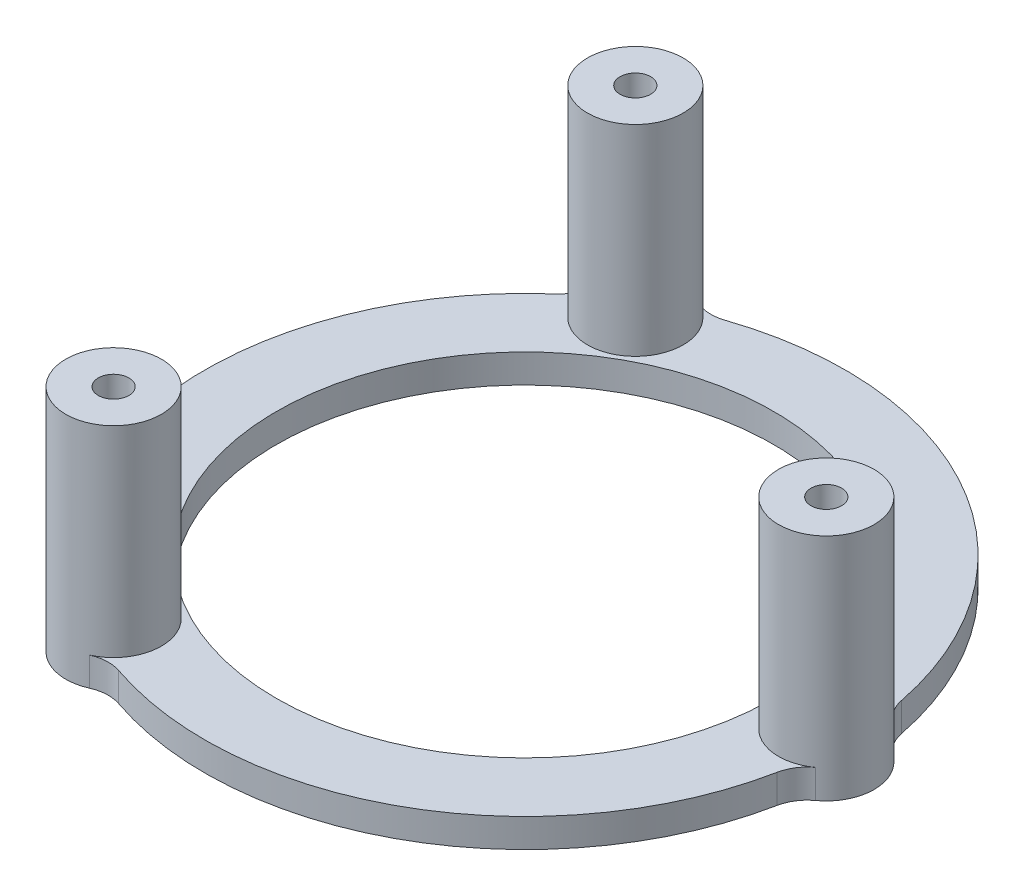
ISO-10303-21;
HEADER;
FILE_DESCRIPTION(('STEP AP214'),'2;1');
FILE_NAME('part.step','',(''),(''),'','','');
FILE_SCHEMA(('AUTOMOTIVE_DESIGN { 1 0 10303 214 1 1 1 1 }'));
ENDSEC;
DATA;
#1=APPLICATION_CONTEXT('core data for automotive mechanical design processes');
#2=APPLICATION_PROTOCOL_DEFINITION('international standard','automotive_design',2000,#1);
#3=PRODUCT_CONTEXT('',#1,'mechanical');
#4=PRODUCT('Part','Part','',(#3));
#5=PRODUCT_RELATED_PRODUCT_CATEGORY('part','',(#4));
#6=PRODUCT_DEFINITION_FORMATION('','',#4);
#7=PRODUCT_DEFINITION_CONTEXT('part definition',#1,'design');
#8=PRODUCT_DEFINITION('design','',#6,#7);
#9=PRODUCT_DEFINITION_SHAPE('','',#8);
#10=(LENGTH_UNIT() NAMED_UNIT(*) SI_UNIT(.MILLI.,.METRE.));
#11=(NAMED_UNIT(*) PLANE_ANGLE_UNIT() SI_UNIT($,.RADIAN.));
#12=(NAMED_UNIT(*) SI_UNIT($,.STERADIAN.) SOLID_ANGLE_UNIT());
#13=UNCERTAINTY_MEASURE_WITH_UNIT(LENGTH_MEASURE(1.E-05),#10,'distance_accuracy_value','');
#14=(GEOMETRIC_REPRESENTATION_CONTEXT(3) GLOBAL_UNCERTAINTY_ASSIGNED_CONTEXT((#13)) GLOBAL_UNIT_ASSIGNED_CONTEXT((#10,
#11,#12)) REPRESENTATION_CONTEXT('',''));
#15=CARTESIAN_POINT('',(0.,0.,0.));
#16=DIRECTION('',(0.,0.,1.));
#17=DIRECTION('',(1.,0.,0.));
#18=AXIS2_PLACEMENT_3D('',#15,#16,#17);
#19=CARTESIAN_POINT('',(0.,1.5,0.));
#20=DIRECTION('',(0.,1.,0.));
#21=DIRECTION('',(0.,0.,1.));
#22=AXIS2_PLACEMENT_3D('',#19,#20,#21);
#23=PLANE('',#22);
#24=CARTESIAN_POINT('',(0.,1.5,0.));
#25=DIRECTION('',(0.,1.,0.));
#26=DIRECTION('',(0.,0.,1.));
#27=AXIS2_PLACEMENT_3D('',#24,#25,#26);
#28=CIRCLE('',#27,13.);
#29=CARTESIAN_POINT('',(0.,1.5,13.));
#30=VERTEX_POINT('',#29);
#31=EDGE_CURVE('E213',#30,#30,#28,.T.);
#32=ORIENTED_EDGE('',*,*,#31,.F.);
#33=EDGE_LOOP('',(#32));
#34=FACE_BOUND('',#33,.T.);
#35=CARTESIAN_POINT('',(-7.875,1.5,13.6399001096049));
#36=DIRECTION('',(0.,1.,0.));
#37=DIRECTION('',(0.,0.,1.));
#38=AXIS2_PLACEMENT_3D('',#35,#36,#37);
#39=CIRCLE('',#38,2.5);
#40=CARTESIAN_POINT('',(-6.8567934789032,1.5,15.9231555662711));
#41=VERTEX_POINT('',#40);
#42=CARTESIAN_POINT('',(-10.3614604893508,1.5,13.8997351243692));
#43=VERTEX_POINT('',#42);
#44=EDGE_CURVE('E74',#41,#43,#39,.T.);
#45=ORIENTED_EDGE('',*,*,#44,.F.);
#46=CARTESIAN_POINT('',(-6.04222826202577,1.5,17.7497599316041));
#47=DIRECTION('',(0.,1.,0.));
#48=DIRECTION('',(0.,0.,1.));
#49=AXIS2_PLACEMENT_3D('',#46,#47,#48);
#50=CIRCLE('',#49,2.);
#51=CARTESIAN_POINT('',(-5.39772391407635,1.5,15.8564522055663));
#52=VERTEX_POINT('',#51);
#53=EDGE_CURVE('E275',#41,#52,#50,.F.);
#54=ORIENTED_EDGE('',*,*,#53,.T.);
#55=CARTESIAN_POINT('',(0.,1.5,0.));
#56=DIRECTION('',(0.,1.,0.));
#57=DIRECTION('',(0.,0.,1.));
#58=AXIS2_PLACEMENT_3D('',#55,#56,#57);
#59=CIRCLE('',#58,16.75);
#60=CARTESIAN_POINT('',(16.4309523809524,1.5,3.25366007057826));
#61=VERTEX_POINT('',#60);
#62=EDGE_CURVE('E224',#52,#61,#59,.T.);
#63=ORIENTED_EDGE('',*,*,#62,.T.);
#64=CARTESIAN_POINT('',(18.3928571428571,1.5,3.64215679542342));
#65=DIRECTION('',(0.,1.,0.));
#66=DIRECTION('',(0.,0.,1.));
#67=AXIS2_PLACEMENT_3D('',#64,#65,#66);
#68=CIRCLE('',#67,2.);
#69=CARTESIAN_POINT('',(17.218253968254,1.5,2.0234204419019));
#70=VERTEX_POINT('',#69);
#71=EDGE_CURVE('E261',#61,#70,#68,.F.);
#72=ORIENTED_EDGE('',*,*,#71,.T.);
#73=CARTESIAN_POINT('',(15.75,1.5,0.));
#74=DIRECTION('',(0.,1.,0.));
#75=DIRECTION('',(0.,0.,1.));
#76=AXIS2_PLACEMENT_3D('',#73,#74,#75);
#77=CIRCLE('',#76,2.5);
#78=CARTESIAN_POINT('',(17.218253968254,1.5,-2.0234204419019));
#79=VERTEX_POINT('',#78);
#80=EDGE_CURVE('E208',#79,#70,#77,.T.);
#81=ORIENTED_EDGE('',*,*,#80,.F.);
#82=CARTESIAN_POINT('',(18.3928571428571,1.5,-3.64215679542341));
#83=DIRECTION('',(0.,1.,0.));
#84=DIRECTION('',(0.,0.,1.));
#85=AXIS2_PLACEMENT_3D('',#82,#83,#84);
#86=CIRCLE('',#85,2.);
#87=CARTESIAN_POINT('',(16.4309523809524,1.5,-3.25366007057825));
#88=VERTEX_POINT('',#87);
#89=EDGE_CURVE('E266',#79,#88,#86,.F.);
#90=ORIENTED_EDGE('',*,*,#89,.T.);
#91=CARTESIAN_POINT('',(0.,1.5,0.));
#92=DIRECTION('',(0.,1.,0.));
#93=DIRECTION('',(0.,0.,1.));
#94=AXIS2_PLACEMENT_3D('',#91,#92,#93);
#95=CIRCLE('',#94,16.75);
#96=CARTESIAN_POINT('',(-5.39772391407637,1.5,-15.8564522055663));
#97=VERTEX_POINT('',#96);
#98=EDGE_CURVE('E227',#88,#97,#95,.T.);
#99=ORIENTED_EDGE('',*,*,#98,.T.);
#100=CARTESIAN_POINT('',(-6.04222826202579,1.5,-17.7497599316041));
#101=DIRECTION('',(0.,1.,0.));
#102=DIRECTION('',(0.,0.,1.));
#103=AXIS2_PLACEMENT_3D('',#100,#101,#102);
#104=CIRCLE('',#103,2.);
#105=CARTESIAN_POINT('',(-6.85679347890322,1.5,-15.9231555662711));
#106=VERTEX_POINT('',#105);
#107=EDGE_CURVE('E67',#97,#106,#104,.F.);
#108=ORIENTED_EDGE('',*,*,#107,.T.);
#109=CARTESIAN_POINT('',(-7.87500000000001,1.5,-13.6399001096049));
#110=DIRECTION('',(0.,1.,0.));
#111=DIRECTION('',(0.,0.,1.));
#112=AXIS2_PLACEMENT_3D('',#109,#110,#111);
#113=CIRCLE('',#112,2.5);
#114=CARTESIAN_POINT('',(-10.3614604893508,1.5,-13.8997351243692));
#115=VERTEX_POINT('',#114);
#116=EDGE_CURVE('E188',#115,#106,#113,.T.);
#117=ORIENTED_EDGE('',*,*,#116,.F.);
#118=CARTESIAN_POINT('',(-12.3506288808314,1.5,-14.1076031361806));
#119=DIRECTION('',(0.,1.,0.));
#120=DIRECTION('',(0.,0.,1.));
#121=AXIS2_PLACEMENT_3D('',#118,#119,#120);
#122=CIRCLE('',#121,2.);
#123=CARTESIAN_POINT('',(-11.033228466876,1.5,-12.602792134988));
#124=VERTEX_POINT('',#123);
#125=EDGE_CURVE('E236',#115,#124,#122,.F.);
#126=ORIENTED_EDGE('',*,*,#125,.T.);
#127=CARTESIAN_POINT('',(0.,1.5,0.));
#128=DIRECTION('',(0.,1.,0.));
#129=DIRECTION('',(0.,0.,1.));
#130=AXIS2_PLACEMENT_3D('',#127,#128,#129);
#131=CIRCLE('',#130,16.75);
#132=CARTESIAN_POINT('',(-11.033228466876,1.5,12.6027921349881));
#133=VERTEX_POINT('',#132);
#134=EDGE_CURVE('E169',#124,#133,#131,.T.);
#135=ORIENTED_EDGE('',*,*,#134,.T.);
#136=CARTESIAN_POINT('',(-12.3506288808314,1.5,14.1076031361807));
#137=DIRECTION('',(0.,1.,0.));
#138=DIRECTION('',(0.,0.,1.));
#139=AXIS2_PLACEMENT_3D('',#136,#137,#138);
#140=CIRCLE('',#139,2.);
#141=EDGE_CURVE('E233',#133,#43,#140,.F.);
#142=ORIENTED_EDGE('',*,*,#141,.T.);
#143=EDGE_LOOP('',(#45,#54,#63,#72,#81,#90,#99,#108,#117,#126,#135,#142));
#144=FACE_BOUND('',#143,.T.);
#145=ADVANCED_FACE('F59',(#34,#144),#23,.T.);
#146=CARTESIAN_POINT('',(0.,0.,0.));
#147=DIRECTION('',(0.,1.,0.));
#148=DIRECTION('',(0.,0.,1.));
#149=AXIS2_PLACEMENT_3D('',#146,#147,#148);
#150=PLANE('',#149);
#151=CARTESIAN_POINT('',(0.,0.,0.));
#152=DIRECTION('',(0.,1.,0.));
#153=DIRECTION('',(0.,0.,1.));
#154=AXIS2_PLACEMENT_3D('',#151,#152,#153);
#155=CIRCLE('',#154,13.);
#156=CARTESIAN_POINT('',(0.,0.,13.));
#157=VERTEX_POINT('',#156);
#158=EDGE_CURVE('E207',#157,#157,#155,.T.);
#159=ORIENTED_EDGE('',*,*,#158,.T.);
#160=EDGE_LOOP('',(#159));
#161=FACE_BOUND('',#160,.T.);
#162=CARTESIAN_POINT('',(0.,0.,0.));
#163=DIRECTION('',(0.,1.,0.));
#164=DIRECTION('',(0.,0.,1.));
#165=AXIS2_PLACEMENT_3D('',#162,#163,#164);
#166=CIRCLE('',#165,16.75);
#167=CARTESIAN_POINT('',(-5.39772391407635,0.,15.8564522055663));
#168=VERTEX_POINT('',#167);
#169=CARTESIAN_POINT('',(16.4309523809524,0.,3.25366007057826));
#170=VERTEX_POINT('',#169);
#171=EDGE_CURVE('E306',#168,#170,#166,.T.);
#172=ORIENTED_EDGE('',*,*,#171,.F.);
#173=CARTESIAN_POINT('',(-6.04222826202577,0.,17.7497599316041));
#174=DIRECTION('',(0.,1.,0.));
#175=DIRECTION('',(0.,0.,1.));
#176=AXIS2_PLACEMENT_3D('',#173,#174,#175);
#177=CIRCLE('',#176,2.);
#178=CARTESIAN_POINT('',(-6.8567934789032,0.,15.9231555662711));
#179=VERTEX_POINT('',#178);
#180=EDGE_CURVE('E278',#168,#179,#177,.T.);
#181=ORIENTED_EDGE('',*,*,#180,.T.);
#182=CARTESIAN_POINT('',(-7.875,0.,13.6399001096049));
#183=DIRECTION('',(0.,1.,0.));
#184=DIRECTION('',(0.,0.,1.));
#185=AXIS2_PLACEMENT_3D('',#182,#183,#184);
#186=CIRCLE('',#185,2.5);
#187=CARTESIAN_POINT('',(-10.3614604893508,0.,13.8997351243692));
#188=VERTEX_POINT('',#187);
#189=EDGE_CURVE('E309',#188,#179,#186,.T.);
#190=ORIENTED_EDGE('',*,*,#189,.F.);
#191=CARTESIAN_POINT('',(-12.3506288808314,0.,14.1076031361807));
#192=DIRECTION('',(0.,1.,0.));
#193=DIRECTION('',(0.,0.,1.));
#194=AXIS2_PLACEMENT_3D('',#191,#192,#193);
#195=CIRCLE('',#194,2.);
#196=CARTESIAN_POINT('',(-11.033228466876,0.,12.6027921349881));
#197=VERTEX_POINT('',#196);
#198=EDGE_CURVE('E273',#188,#197,#195,.T.);
#199=ORIENTED_EDGE('',*,*,#198,.T.);
#200=CARTESIAN_POINT('',(0.,0.,0.));
#201=DIRECTION('',(0.,1.,0.));
#202=DIRECTION('',(0.,0.,1.));
#203=AXIS2_PLACEMENT_3D('',#200,#201,#202);
#204=CIRCLE('',#203,16.75);
#205=CARTESIAN_POINT('',(-11.033228466876,0.,-12.602792134988));
#206=VERTEX_POINT('',#205);
#207=EDGE_CURVE('E312',#206,#197,#204,.T.);
#208=ORIENTED_EDGE('',*,*,#207,.F.);
#209=CARTESIAN_POINT('',(-12.3506288808314,0.,-14.1076031361806));
#210=DIRECTION('',(0.,1.,0.));
#211=DIRECTION('',(0.,0.,1.));
#212=AXIS2_PLACEMENT_3D('',#209,#210,#211);
#213=CIRCLE('',#212,2.);
#214=CARTESIAN_POINT('',(-10.3614604893508,0.,-13.8997351243692));
#215=VERTEX_POINT('',#214);
#216=EDGE_CURVE('E251',#206,#215,#213,.T.);
#217=ORIENTED_EDGE('',*,*,#216,.T.);
#218=CARTESIAN_POINT('',(-7.87500000000001,0.,-13.6399001096049));
#219=DIRECTION('',(0.,1.,0.));
#220=DIRECTION('',(0.,0.,1.));
#221=AXIS2_PLACEMENT_3D('',#218,#219,#220);
#222=CIRCLE('',#221,2.5);
#223=CARTESIAN_POINT('',(-6.85679347890322,0.,-15.9231555662711));
#224=VERTEX_POINT('',#223);
#225=EDGE_CURVE('E314',#224,#215,#222,.T.);
#226=ORIENTED_EDGE('',*,*,#225,.F.);
#227=CARTESIAN_POINT('',(-6.04222826202579,0.,-17.7497599316041));
#228=DIRECTION('',(0.,1.,0.));
#229=DIRECTION('',(0.,0.,1.));
#230=AXIS2_PLACEMENT_3D('',#227,#228,#229);
#231=CIRCLE('',#230,2.);
#232=CARTESIAN_POINT('',(-5.39772391407637,0.,-15.8564522055663));
#233=VERTEX_POINT('',#232);
#234=EDGE_CURVE('E13',#224,#233,#231,.T.);
#235=ORIENTED_EDGE('',*,*,#234,.T.);
#236=CARTESIAN_POINT('',(0.,0.,0.));
#237=DIRECTION('',(0.,1.,0.));
#238=DIRECTION('',(0.,0.,1.));
#239=AXIS2_PLACEMENT_3D('',#236,#237,#238);
#240=CIRCLE('',#239,16.75);
#241=CARTESIAN_POINT('',(16.4309523809524,0.,-3.25366007057825));
#242=VERTEX_POINT('',#241);
#243=EDGE_CURVE('E316',#242,#233,#240,.T.);
#244=ORIENTED_EDGE('',*,*,#243,.F.);
#245=CARTESIAN_POINT('',(18.3928571428571,0.,-3.64215679542341));
#246=DIRECTION('',(0.,1.,0.));
#247=DIRECTION('',(0.,0.,1.));
#248=AXIS2_PLACEMENT_3D('',#245,#246,#247);
#249=CIRCLE('',#248,2.);
#250=CARTESIAN_POINT('',(17.218253968254,0.,-2.0234204419019));
#251=VERTEX_POINT('',#250);
#252=EDGE_CURVE('E268',#242,#251,#249,.T.);
#253=ORIENTED_EDGE('',*,*,#252,.T.);
#254=CARTESIAN_POINT('',(15.75,0.,0.));
#255=DIRECTION('',(0.,1.,0.));
#256=DIRECTION('',(0.,0.,1.));
#257=AXIS2_PLACEMENT_3D('',#254,#255,#256);
#258=CIRCLE('',#257,2.5);
#259=CARTESIAN_POINT('',(17.218253968254,0.,2.0234204419019));
#260=VERTEX_POINT('',#259);
#261=EDGE_CURVE('E319',#260,#251,#258,.T.);
#262=ORIENTED_EDGE('',*,*,#261,.F.);
#263=CARTESIAN_POINT('',(18.3928571428571,0.,3.64215679542342));
#264=DIRECTION('',(0.,1.,0.));
#265=DIRECTION('',(0.,0.,1.));
#266=AXIS2_PLACEMENT_3D('',#263,#264,#265);
#267=CIRCLE('',#266,2.);
#268=EDGE_CURVE('E264',#260,#170,#267,.T.);
#269=ORIENTED_EDGE('',*,*,#268,.T.);
#270=EDGE_LOOP('',(#172,#181,#190,#199,#208,#217,#226,#235,#244,#253,#262,#269));
#271=FACE_BOUND('',#270,.T.);
#272=ADVANCED_FACE('F336',(#161,#271),#150,.F.);
#273=CARTESIAN_POINT('',(0.,1.5,0.));
#274=DIRECTION('',(0.,-1.,0.));
#275=DIRECTION('',(0.,0.,-1.));
#276=AXIS2_PLACEMENT_3D('',#273,#274,#275);
#277=CYLINDRICAL_SURFACE('',#276,13.);
#278=ORIENTED_EDGE('',*,*,#31,.T.);
#279=EDGE_LOOP('',(#278));
#280=FACE_BOUND('',#279,.T.);
#281=ORIENTED_EDGE('',*,*,#158,.F.);
#282=EDGE_LOOP('',(#281));
#283=FACE_BOUND('',#282,.T.);
#284=ADVANCED_FACE('F332',(#280,#283),#277,.F.);
#285=CARTESIAN_POINT('',(15.75,12.,0.));
#286=DIRECTION('',(0.,-1.,0.));
#287=DIRECTION('',(0.,0.,-1.));
#288=AXIS2_PLACEMENT_3D('',#285,#286,#287);
#289=CYLINDRICAL_SURFACE('',#288,2.5);
#290=CARTESIAN_POINT('',(15.75,12.,0.));
#291=DIRECTION('',(0.,1.,0.));
#292=DIRECTION('',(0.,0.,1.));
#293=AXIS2_PLACEMENT_3D('',#290,#291,#292);
#294=CIRCLE('',#293,2.5);
#295=CARTESIAN_POINT('',(15.75,12.,2.5));
#296=VERTEX_POINT('',#295);
#297=EDGE_CURVE('E203',#296,#296,#294,.T.);
#298=ORIENTED_EDGE('',*,*,#297,.F.);
#299=EDGE_LOOP('',(#298));
#300=FACE_BOUND('',#299,.T.);
#301=ORIENTED_EDGE('',*,*,#80,.T.);
#302=DIRECTION('',(0.,-1.,0.));
#303=VECTOR('',#302,1.);
#304=CARTESIAN_POINT('',(17.218253968254,12.,2.0234204419019));
#305=LINE('',#304,#303);
#306=EDGE_CURVE('E296',#70,#260,#305,.T.);
#307=ORIENTED_EDGE('',*,*,#306,.T.);
#308=ORIENTED_EDGE('',*,*,#261,.T.);
#309=DIRECTION('',(0.,-1.,0.));
#310=VECTOR('',#309,1.);
#311=CARTESIAN_POINT('',(17.218253968254,12.,-2.0234204419019));
#312=LINE('',#311,#310);
#313=EDGE_CURVE('E298',#251,#79,#312,.F.);
#314=ORIENTED_EDGE('',*,*,#313,.T.);
#315=EDGE_LOOP('',(#301,#307,#308,#314));
#316=FACE_BOUND('',#315,.T.);
#317=ADVANCED_FACE('F396',(#300,#316),#289,.T.);
#318=CARTESIAN_POINT('',(15.75,12.,0.));
#319=DIRECTION('',(0.,1.,0.));
#320=DIRECTION('',(0.,0.,1.));
#321=AXIS2_PLACEMENT_3D('',#318,#319,#320);
#322=PLANE('',#321);
#323=CARTESIAN_POINT('',(15.75,12.,0.));
#324=DIRECTION('',(0.,1.,0.));
#325=DIRECTION('',(0.,0.,1.));
#326=AXIS2_PLACEMENT_3D('',#323,#324,#325);
#327=CIRCLE('',#326,0.799999999999988);
#328=CARTESIAN_POINT('',(15.75,12.,0.799999999999988));
#329=VERTEX_POINT('',#328);
#330=EDGE_CURVE('E163',#329,#329,#327,.T.);
#331=ORIENTED_EDGE('',*,*,#330,.F.);
#332=EDGE_LOOP('',(#331));
#333=FACE_BOUND('',#332,.T.);
#334=ORIENTED_EDGE('',*,*,#297,.T.);
#335=EDGE_LOOP('',(#334));
#336=FACE_BOUND('',#335,.T.);
#337=ADVANCED_FACE('F393',(#333,#336),#322,.T.);
#338=CARTESIAN_POINT('',(-7.875,12.,13.6399001096049));
#339=DIRECTION('',(0.,-1.,0.));
#340=DIRECTION('',(0.,0.,-1.));
#341=AXIS2_PLACEMENT_3D('',#338,#339,#340);
#342=CYLINDRICAL_SURFACE('',#341,2.5);
#343=CARTESIAN_POINT('',(-7.875,12.,13.6399001096049));
#344=DIRECTION('',(0.,1.,0.));
#345=DIRECTION('',(0.,0.,1.));
#346=AXIS2_PLACEMENT_3D('',#343,#344,#345);
#347=CIRCLE('',#346,2.5);
#348=CARTESIAN_POINT('',(-7.875,12.,16.1399001096049));
#349=VERTEX_POINT('',#348);
#350=EDGE_CURVE('E212',#349,#349,#347,.T.);
#351=ORIENTED_EDGE('',*,*,#350,.F.);
#352=EDGE_LOOP('',(#351));
#353=FACE_BOUND('',#352,.T.);
#354=ORIENTED_EDGE('',*,*,#44,.T.);
#355=DIRECTION('',(0.,-1.,0.));
#356=VECTOR('',#355,1.);
#357=CARTESIAN_POINT('',(-10.3614604893508,12.,13.8997351243692));
#358=LINE('',#357,#356);
#359=EDGE_CURVE('E254',#43,#188,#358,.T.);
#360=ORIENTED_EDGE('',*,*,#359,.T.);
#361=ORIENTED_EDGE('',*,*,#189,.T.);
#362=DIRECTION('',(0.,-1.,0.));
#363=VECTOR('',#362,1.);
#364=CARTESIAN_POINT('',(-6.8567934789032,12.,15.9231555662711));
#365=LINE('',#364,#363);
#366=EDGE_CURVE('E252',#179,#41,#365,.F.);
#367=ORIENTED_EDGE('',*,*,#366,.T.);
#368=EDGE_LOOP('',(#354,#360,#361,#367));
#369=FACE_BOUND('',#368,.T.);
#370=ADVANCED_FACE('F373',(#353,#369),#342,.T.);
#371=CARTESIAN_POINT('',(-7.875,12.,13.6399001096049));
#372=DIRECTION('',(0.,1.,0.));
#373=DIRECTION('',(0.,0.,1.));
#374=AXIS2_PLACEMENT_3D('',#371,#372,#373);
#375=PLANE('',#374);
#376=CARTESIAN_POINT('',(-7.875,12.,13.6399001096049));
#377=DIRECTION('',(0.,1.,0.));
#378=DIRECTION('',(0.,0.,1.));
#379=AXIS2_PLACEMENT_3D('',#376,#377,#378);
#380=CIRCLE('',#379,0.79999999999999);
#381=CARTESIAN_POINT('',(-7.875,12.,14.4399001096049));
#382=VERTEX_POINT('',#381);
#383=EDGE_CURVE('E180',#382,#382,#380,.T.);
#384=ORIENTED_EDGE('',*,*,#383,.F.);
#385=EDGE_LOOP('',(#384));
#386=FACE_BOUND('',#385,.T.);
#387=ORIENTED_EDGE('',*,*,#350,.T.);
#388=EDGE_LOOP('',(#387));
#389=FACE_BOUND('',#388,.T.);
#390=ADVANCED_FACE('F376',(#386,#389),#375,.T.);
#391=CARTESIAN_POINT('',(-7.87500000000001,12.,-13.6399001096049));
#392=DIRECTION('',(0.,-1.,0.));
#393=DIRECTION('',(0.,0.,-1.));
#394=AXIS2_PLACEMENT_3D('',#391,#392,#393);
#395=CYLINDRICAL_SURFACE('',#394,2.5);
#396=CARTESIAN_POINT('',(-7.87500000000001,12.,-13.6399001096049));
#397=DIRECTION('',(0.,1.,0.));
#398=DIRECTION('',(0.,0.,1.));
#399=AXIS2_PLACEMENT_3D('',#396,#397,#398);
#400=CIRCLE('',#399,2.5);
#401=CARTESIAN_POINT('',(-7.87500000000001,12.,-11.1399001096049));
#402=VERTEX_POINT('',#401);
#403=EDGE_CURVE('E189',#402,#402,#400,.T.);
#404=ORIENTED_EDGE('',*,*,#403,.F.);
#405=EDGE_LOOP('',(#404));
#406=FACE_BOUND('',#405,.T.);
#407=ORIENTED_EDGE('',*,*,#225,.T.);
#408=DIRECTION('',(0.,-1.,0.));
#409=VECTOR('',#408,1.);
#410=CARTESIAN_POINT('',(-10.3614604893508,12.,-13.8997351243692));
#411=LINE('',#410,#409);
#412=EDGE_CURVE('E256',#215,#115,#411,.F.);
#413=ORIENTED_EDGE('',*,*,#412,.T.);
#414=ORIENTED_EDGE('',*,*,#116,.T.);
#415=DIRECTION('',(0.,-1.,0.));
#416=VECTOR('',#415,1.);
#417=CARTESIAN_POINT('',(-6.85679347890322,12.,-15.9231555662711));
#418=LINE('',#417,#416);
#419=EDGE_CURVE('E286',#106,#224,#418,.T.);
#420=ORIENTED_EDGE('',*,*,#419,.T.);
#421=EDGE_LOOP('',(#407,#413,#414,#420));
#422=FACE_BOUND('',#421,.T.);
#423=ADVANCED_FACE('F374',(#406,#422),#395,.T.);
#424=CARTESIAN_POINT('',(-7.87500000000001,12.,-13.6399001096049));
#425=DIRECTION('',(0.,1.,0.));
#426=DIRECTION('',(0.,0.,1.));
#427=AXIS2_PLACEMENT_3D('',#424,#425,#426);
#428=PLANE('',#427);
#429=CARTESIAN_POINT('',(-7.87500000000001,12.,-13.6399001096049));
#430=DIRECTION('',(0.,1.,0.));
#431=DIRECTION('',(0.,0.,1.));
#432=AXIS2_PLACEMENT_3D('',#429,#430,#431);
#433=CIRCLE('',#432,0.79999999999999);
#434=CARTESIAN_POINT('',(-7.87500000000001,12.,-12.8399001096049));
#435=VERTEX_POINT('',#434);
#436=EDGE_CURVE('E162',#435,#435,#433,.T.);
#437=ORIENTED_EDGE('',*,*,#436,.F.);
#438=EDGE_LOOP('',(#437));
#439=FACE_BOUND('',#438,.T.);
#440=ORIENTED_EDGE('',*,*,#403,.T.);
#441=EDGE_LOOP('',(#440));
#442=FACE_BOUND('',#441,.T.);
#443=ADVANCED_FACE('F375',(#439,#442),#428,.T.);
#444=CARTESIAN_POINT('',(-7.875,5.,13.6399001096049));
#445=DIRECTION('',(0.,1.,0.));
#446=DIRECTION('',(0.,0.,1.));
#447=AXIS2_PLACEMENT_3D('',#444,#445,#446);
#448=CONICAL_SURFACE('',#447,0.799999999999999,1.02974425867665);
#449=CARTESIAN_POINT('',(-7.875,4.51931150477795,13.6399001096049));
#450=VERTEX_POINT('',#449);
#451=VERTEX_LOOP('',#450);
#452=FACE_BOUND('',#451,.T.);
#453=CARTESIAN_POINT('',(-7.875,5.,13.6399001096049));
#454=DIRECTION('',(0.,1.,0.));
#455=DIRECTION('',(0.,0.,1.));
#456=AXIS2_PLACEMENT_3D('',#453,#454,#455);
#457=CIRCLE('',#456,0.799999999999999);
#458=CARTESIAN_POINT('',(-7.875,5.,14.4399001096049));
#459=VERTEX_POINT('',#458);
#460=EDGE_CURVE('E183',#459,#459,#457,.T.);
#461=ORIENTED_EDGE('',*,*,#460,.T.);
#462=EDGE_LOOP('',(#461));
#463=FACE_BOUND('',#462,.T.);
#464=ADVANCED_FACE('F383',(#452,#463),#448,.F.);
#465=CARTESIAN_POINT('',(-7.875,12.,13.6399001096049));
#466=DIRECTION('',(0.,1.,0.));
#467=DIRECTION('',(0.,0.,1.));
#468=AXIS2_PLACEMENT_3D('',#465,#466,#467);
#469=CYLINDRICAL_SURFACE('',#468,0.799999999999994);
#470=ORIENTED_EDGE('',*,*,#460,.F.);
#471=EDGE_LOOP('',(#470));
#472=FACE_BOUND('',#471,.T.);
#473=ORIENTED_EDGE('',*,*,#383,.T.);
#474=EDGE_LOOP('',(#473));
#475=FACE_BOUND('',#474,.T.);
#476=ADVANCED_FACE('F428',(#472,#475),#469,.F.);
#477=CARTESIAN_POINT('',(-7.87500000000001,5.,-13.6399001096049));
#478=DIRECTION('',(0.,1.,0.));
#479=DIRECTION('',(0.,0.,1.));
#480=AXIS2_PLACEMENT_3D('',#477,#478,#479);
#481=CONICAL_SURFACE('',#480,0.799999999999999,1.02974425867665);
#482=CARTESIAN_POINT('',(-7.87500000000001,4.51931150477795,-13.6399001096049));
#483=VERTEX_POINT('',#482);
#484=VERTEX_LOOP('',#483);
#485=FACE_BOUND('',#484,.T.);
#486=CARTESIAN_POINT('',(-7.87500000000001,5.,-13.6399001096049));
#487=DIRECTION('',(0.,1.,0.));
#488=DIRECTION('',(0.,0.,1.));
#489=AXIS2_PLACEMENT_3D('',#486,#487,#488);
#490=CIRCLE('',#489,0.799999999999999);
#491=CARTESIAN_POINT('',(-7.87500000000001,5.,-12.8399001096049));
#492=VERTEX_POINT('',#491);
#493=EDGE_CURVE('E166',#492,#492,#490,.T.);
#494=ORIENTED_EDGE('',*,*,#493,.T.);
#495=EDGE_LOOP('',(#494));
#496=FACE_BOUND('',#495,.T.);
#497=ADVANCED_FACE('F424',(#485,#496),#481,.F.);
#498=CARTESIAN_POINT('',(-7.87500000000001,12.,-13.6399001096049));
#499=DIRECTION('',(0.,1.,0.));
#500=DIRECTION('',(0.,0.,1.));
#501=AXIS2_PLACEMENT_3D('',#498,#499,#500);
#502=CYLINDRICAL_SURFACE('',#501,0.799999999999994);
#503=ORIENTED_EDGE('',*,*,#493,.F.);
#504=EDGE_LOOP('',(#503));
#505=FACE_BOUND('',#504,.T.);
#506=ORIENTED_EDGE('',*,*,#436,.T.);
#507=EDGE_LOOP('',(#506));
#508=FACE_BOUND('',#507,.T.);
#509=ADVANCED_FACE('F156',(#505,#508),#502,.F.);
#510=CARTESIAN_POINT('',(15.75,5.,0.));
#511=DIRECTION('',(0.,1.,0.));
#512=DIRECTION('',(0.,0.,1.));
#513=AXIS2_PLACEMENT_3D('',#510,#511,#512);
#514=CONICAL_SURFACE('',#513,0.799999999999999,1.02974425867665);
#515=CARTESIAN_POINT('',(15.75,4.51931150477795,0.));
#516=VERTEX_POINT('',#515);
#517=VERTEX_LOOP('',#516);
#518=FACE_BOUND('',#517,.T.);
#519=CARTESIAN_POINT('',(15.75,5.,0.));
#520=DIRECTION('',(0.,1.,0.));
#521=DIRECTION('',(0.,0.,1.));
#522=AXIS2_PLACEMENT_3D('',#519,#520,#521);
#523=CIRCLE('',#522,0.799999999999999);
#524=CARTESIAN_POINT('',(15.75,5.,0.799999999999999));
#525=VERTEX_POINT('',#524);
#526=EDGE_CURVE('E160',#525,#525,#523,.T.);
#527=ORIENTED_EDGE('',*,*,#526,.T.);
#528=EDGE_LOOP('',(#527));
#529=FACE_BOUND('',#528,.T.);
#530=ADVANCED_FACE('F152',(#518,#529),#514,.F.);
#531=CARTESIAN_POINT('',(15.75,12.,0.));
#532=DIRECTION('',(0.,1.,0.));
#533=DIRECTION('',(0.,0.,1.));
#534=AXIS2_PLACEMENT_3D('',#531,#532,#533);
#535=CYLINDRICAL_SURFACE('',#534,0.799999999999993);
#536=ORIENTED_EDGE('',*,*,#526,.F.);
#537=EDGE_LOOP('',(#536));
#538=FACE_BOUND('',#537,.T.);
#539=ORIENTED_EDGE('',*,*,#330,.T.);
#540=EDGE_LOOP('',(#539));
#541=FACE_BOUND('',#540,.T.);
#542=ADVANCED_FACE('F155',(#538,#541),#535,.F.);
#543=CARTESIAN_POINT('',(0.,-8.5,0.));
#544=DIRECTION('',(0.,1.,0.));
#545=DIRECTION('',(0.,0.,1.));
#546=AXIS2_PLACEMENT_3D('',#543,#544,#545);
#547=CYLINDRICAL_SURFACE('',#546,16.75);
#548=ORIENTED_EDGE('',*,*,#171,.T.);
#549=DIRECTION('',(0.,1.,0.));
#550=VECTOR('',#549,1.);
#551=CARTESIAN_POINT('',(16.4309523809524,-8.5,3.25366007057826));
#552=LINE('',#551,#550);
#553=EDGE_CURVE('E301',#170,#61,#552,.T.);
#554=ORIENTED_EDGE('',*,*,#553,.T.);
#555=ORIENTED_EDGE('',*,*,#62,.F.);
#556=DIRECTION('',(0.,1.,0.));
#557=VECTOR('',#556,1.);
#558=CARTESIAN_POINT('',(-5.39772391407635,-8.5,15.8564522055663));
#559=LINE('',#558,#557);
#560=EDGE_CURVE('E304',#52,#168,#559,.F.);
#561=ORIENTED_EDGE('',*,*,#560,.T.);
#562=EDGE_LOOP('',(#548,#554,#555,#561));
#563=FACE_BOUND('',#562,.T.);
#564=ADVANCED_FACE('F412',(#563),#547,.T.);
#565=CARTESIAN_POINT('',(0.,-8.5,0.));
#566=DIRECTION('',(0.,1.,0.));
#567=DIRECTION('',(0.,0.,1.));
#568=AXIS2_PLACEMENT_3D('',#565,#566,#567);
#569=CYLINDRICAL_SURFACE('',#568,16.75);
#570=ORIENTED_EDGE('',*,*,#134,.F.);
#571=DIRECTION('',(0.,1.,0.));
#572=VECTOR('',#571,1.);
#573=CARTESIAN_POINT('',(-11.033228466876,-8.5,-12.602792134988));
#574=LINE('',#573,#572);
#575=EDGE_CURVE('E242',#124,#206,#574,.F.);
#576=ORIENTED_EDGE('',*,*,#575,.T.);
#577=ORIENTED_EDGE('',*,*,#207,.T.);
#578=DIRECTION('',(0.,1.,0.));
#579=VECTOR('',#578,1.);
#580=CARTESIAN_POINT('',(-11.033228466876,-8.5,12.6027921349881));
#581=LINE('',#580,#579);
#582=EDGE_CURVE('E245',#197,#133,#581,.T.);
#583=ORIENTED_EDGE('',*,*,#582,.T.);
#584=EDGE_LOOP('',(#570,#576,#577,#583));
#585=FACE_BOUND('',#584,.T.);
#586=ADVANCED_FACE('F240',(#585),#569,.T.);
#587=CARTESIAN_POINT('',(0.,-8.5,0.));
#588=DIRECTION('',(0.,1.,0.));
#589=DIRECTION('',(0.,0.,1.));
#590=AXIS2_PLACEMENT_3D('',#587,#588,#589);
#591=CYLINDRICAL_SURFACE('',#590,16.75);
#592=ORIENTED_EDGE('',*,*,#98,.F.);
#593=DIRECTION('',(0.,1.,0.));
#594=VECTOR('',#593,1.);
#595=CARTESIAN_POINT('',(16.4309523809524,-8.5,-3.25366007057825));
#596=LINE('',#595,#594);
#597=EDGE_CURVE('E290',#88,#242,#596,.F.);
#598=ORIENTED_EDGE('',*,*,#597,.T.);
#599=ORIENTED_EDGE('',*,*,#243,.T.);
#600=DIRECTION('',(0.,1.,0.));
#601=VECTOR('',#600,1.);
#602=CARTESIAN_POINT('',(-5.39772391407638,-8.5,-15.8564522055663));
#603=LINE('',#602,#601);
#604=EDGE_CURVE('E292',#233,#97,#603,.T.);
#605=ORIENTED_EDGE('',*,*,#604,.T.);
#606=EDGE_LOOP('',(#592,#598,#599,#605));
#607=FACE_BOUND('',#606,.T.);
#608=ADVANCED_FACE('F349',(#607),#591,.T.);
#609=CARTESIAN_POINT('',(18.3928571428571,12.,3.64215679542342));
#610=DIRECTION('',(0.,-1.,0.));
#611=DIRECTION('',(0.,0.,-1.));
#612=AXIS2_PLACEMENT_3D('',#609,#610,#611);
#613=CYLINDRICAL_SURFACE('',#612,2.);
#614=ORIENTED_EDGE('',*,*,#268,.F.);
#615=ORIENTED_EDGE('',*,*,#306,.F.);
#616=ORIENTED_EDGE('',*,*,#71,.F.);
#617=ORIENTED_EDGE('',*,*,#553,.F.);
#618=EDGE_LOOP('',(#614,#615,#616,#617));
#619=FACE_BOUND('',#618,.T.);
#620=ADVANCED_FACE('F345',(#619),#613,.F.);
#621=CARTESIAN_POINT('',(18.3928571428571,-8.5,-3.64215679542341));
#622=DIRECTION('',(0.,-1.,0.));
#623=DIRECTION('',(0.,0.,-1.));
#624=AXIS2_PLACEMENT_3D('',#621,#622,#623);
#625=CYLINDRICAL_SURFACE('',#624,2.);
#626=ORIENTED_EDGE('',*,*,#252,.F.);
#627=ORIENTED_EDGE('',*,*,#597,.F.);
#628=ORIENTED_EDGE('',*,*,#89,.F.);
#629=ORIENTED_EDGE('',*,*,#313,.F.);
#630=EDGE_LOOP('',(#626,#627,#628,#629));
#631=FACE_BOUND('',#630,.T.);
#632=ADVANCED_FACE('F348',(#631),#625,.F.);
#633=CARTESIAN_POINT('',(-12.3506288808314,-8.5,-14.1076031361806));
#634=DIRECTION('',(0.,-1.,0.));
#635=DIRECTION('',(0.,0.,-1.));
#636=AXIS2_PLACEMENT_3D('',#633,#634,#635);
#637=CYLINDRICAL_SURFACE('',#636,2.);
#638=ORIENTED_EDGE('',*,*,#216,.F.);
#639=ORIENTED_EDGE('',*,*,#575,.F.);
#640=ORIENTED_EDGE('',*,*,#125,.F.);
#641=ORIENTED_EDGE('',*,*,#412,.F.);
#642=EDGE_LOOP('',(#638,#639,#640,#641));
#643=FACE_BOUND('',#642,.T.);
#644=ADVANCED_FACE('F248',(#643),#637,.F.);
#645=CARTESIAN_POINT('',(-12.3506288808314,12.,14.1076031361807));
#646=DIRECTION('',(0.,-1.,0.));
#647=DIRECTION('',(0.,0.,-1.));
#648=AXIS2_PLACEMENT_3D('',#645,#646,#647);
#649=CYLINDRICAL_SURFACE('',#648,2.);
#650=ORIENTED_EDGE('',*,*,#198,.F.);
#651=ORIENTED_EDGE('',*,*,#359,.F.);
#652=ORIENTED_EDGE('',*,*,#141,.F.);
#653=ORIENTED_EDGE('',*,*,#582,.F.);
#654=EDGE_LOOP('',(#650,#651,#652,#653));
#655=FACE_BOUND('',#654,.T.);
#656=ADVANCED_FACE('F356',(#655),#649,.F.);
#657=CARTESIAN_POINT('',(-6.04222826202577,-8.5,17.7497599316041));
#658=DIRECTION('',(0.,-1.,0.));
#659=DIRECTION('',(0.,0.,-1.));
#660=AXIS2_PLACEMENT_3D('',#657,#658,#659);
#661=CYLINDRICAL_SURFACE('',#660,2.);
#662=ORIENTED_EDGE('',*,*,#180,.F.);
#663=ORIENTED_EDGE('',*,*,#560,.F.);
#664=ORIENTED_EDGE('',*,*,#53,.F.);
#665=ORIENTED_EDGE('',*,*,#366,.F.);
#666=EDGE_LOOP('',(#662,#663,#664,#665));
#667=FACE_BOUND('',#666,.T.);
#668=ADVANCED_FACE('F358',(#667),#661,.F.);
#669=CARTESIAN_POINT('',(-6.04222826202579,12.,-17.7497599316041));
#670=DIRECTION('',(0.,-1.,0.));
#671=DIRECTION('',(0.,0.,-1.));
#672=AXIS2_PLACEMENT_3D('',#669,#670,#671);
#673=CYLINDRICAL_SURFACE('',#672,2.);
#674=ORIENTED_EDGE('',*,*,#234,.F.);
#675=ORIENTED_EDGE('',*,*,#419,.F.);
#676=ORIENTED_EDGE('',*,*,#107,.F.);
#677=ORIENTED_EDGE('',*,*,#604,.F.);
#678=EDGE_LOOP('',(#674,#675,#676,#677));
#679=FACE_BOUND('',#678,.T.);
#680=ADVANCED_FACE('F61',(#679),#673,.F.);
#681=CLOSED_SHELL('',(#145,#272,#284,#317,#337,#370,#390,#423,#443,#464,#476,#497,#509,#530,
#542,#564,#586,#608,#620,#632,#644,#656,#668,#680));
#682=MANIFOLD_SOLID_BREP('B2',#681);
#683=ADVANCED_BREP_SHAPE_REPRESENTATION('',(#18,#682),#14);
#684=SHAPE_DEFINITION_REPRESENTATION(#9,#683);
ENDSEC;
END-ISO-10303-21;
